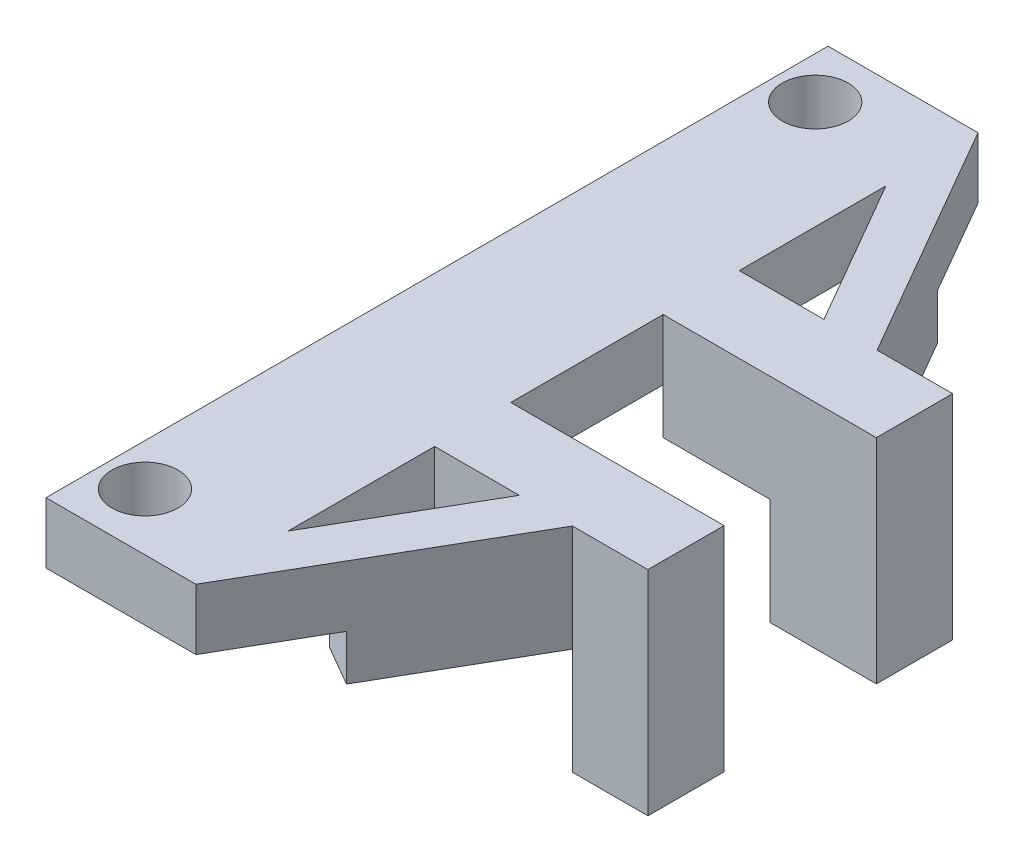
ISO-10303-21;
HEADER;
FILE_DESCRIPTION(('STEP AP214'),'2;1');
FILE_NAME('part.step','',(''),(''),'','','');
FILE_SCHEMA(('AUTOMOTIVE_DESIGN { 1 0 10303 214 1 1 1 1 }'));
ENDSEC;
DATA;
#1=APPLICATION_CONTEXT('core data for automotive mechanical design processes');
#2=APPLICATION_PROTOCOL_DEFINITION('international standard','automotive_design',2000,#1);
#3=PRODUCT_CONTEXT('',#1,'mechanical');
#4=PRODUCT('Part','Part','',(#3));
#5=PRODUCT_RELATED_PRODUCT_CATEGORY('part','',(#4));
#6=PRODUCT_DEFINITION_FORMATION('','',#4);
#7=PRODUCT_DEFINITION_CONTEXT('part definition',#1,'design');
#8=PRODUCT_DEFINITION('design','',#6,#7);
#9=PRODUCT_DEFINITION_SHAPE('','',#8);
#10=(LENGTH_UNIT() NAMED_UNIT(*) SI_UNIT(.MILLI.,.METRE.));
#11=(NAMED_UNIT(*) PLANE_ANGLE_UNIT() SI_UNIT($,.RADIAN.));
#12=(NAMED_UNIT(*) SI_UNIT($,.STERADIAN.) SOLID_ANGLE_UNIT());
#13=UNCERTAINTY_MEASURE_WITH_UNIT(LENGTH_MEASURE(1.E-05),#10,'distance_accuracy_value','');
#14=(GEOMETRIC_REPRESENTATION_CONTEXT(3) GLOBAL_UNCERTAINTY_ASSIGNED_CONTEXT((#13)) GLOBAL_UNIT_ASSIGNED_CONTEXT((#10,
#11,#12)) REPRESENTATION_CONTEXT('',''));
#15=CARTESIAN_POINT('',(0.,0.,0.));
#16=DIRECTION('',(0.,0.,1.));
#17=DIRECTION('',(1.,0.,0.));
#18=AXIS2_PLACEMENT_3D('',#15,#16,#17);
#19=CARTESIAN_POINT('',(0.,-1.905,0.));
#20=DIRECTION('',(0.,1.,0.));
#21=DIRECTION('',(0.,0.,1.));
#22=AXIS2_PLACEMENT_3D('',#19,#20,#21);
#23=PLANE('',#22);
#24=DIRECTION('',(0.499999999999997,0.,-0.86602540378444));
#25=VECTOR('',#24,1.);
#26=CARTESIAN_POINT('',(4.40340516699403,-1.905,2.54230715851497));
#27=LINE('',#26,#25);
#28=CARTESIAN_POINT('',(10.2449238535713,-1.905,-7.5755));
#29=VERTEX_POINT('',#28);
#30=CARTESIAN_POINT('',(10.6073505544324,-1.905,-8.20324145991094));
#31=VERTEX_POINT('',#30);
#32=EDGE_CURVE('E701',#29,#31,#27,.T.);
#33=ORIENTED_EDGE('',*,*,#32,.F.);
#34=DIRECTION('',(0.499999999999997,0.,-0.86602540378444));
#35=VECTOR('',#34,1.);
#36=CARTESIAN_POINT('',(4.40340516699403,-1.905,2.54230715851497));
#37=LINE('',#36,#35);
#38=CARTESIAN_POINT('',(6.79735055443242,-1.905,-1.60412788307351));
#39=VERTEX_POINT('',#38);
#40=EDGE_CURVE('E530',#39,#29,#37,.T.);
#41=ORIENTED_EDGE('',*,*,#40,.F.);
#42=DIRECTION('',(0.86602540378444,0.,0.499999999999997));
#43=VECTOR('',#42,1.);
#44=CARTESIAN_POINT('',(2.39394538743839,-1.905,-4.14643504158848));
#45=LINE('',#44,#43);
#46=CARTESIAN_POINT('',(5.13500000000002,-1.905,-2.56388642316257));
#47=VERTEX_POINT('',#46);
#48=EDGE_CURVE('E527',#47,#39,#45,.T.);
#49=ORIENTED_EDGE('',*,*,#48,.F.);
#50=DIRECTION('',(0.499999999999997,0.,-0.86602540378444));
#51=VECTOR('',#50,1.);
#52=CARTESIAN_POINT('',(2.74105461256163,-1.905,1.58254861842591));
#53=LINE('',#52,#51);
#54=CARTESIAN_POINT('',(8.02845644766147,-1.905,-7.5755));
#55=VERTEX_POINT('',#54);
#56=EDGE_CURVE('E524',#47,#55,#53,.T.);
#57=ORIENTED_EDGE('',*,*,#56,.T.);
#58=DIRECTION('',(1.,0.,0.));
#59=VECTOR('',#58,1.);
#60=CARTESIAN_POINT('',(0.,-1.905,-7.5755));
#61=LINE('',#60,#59);
#62=CARTESIAN_POINT('',(4.5,-1.905,-7.5755));
#63=VERTEX_POINT('',#62);
#64=EDGE_CURVE('E521',#63,#55,#61,.T.);
#65=ORIENTED_EDGE('',*,*,#64,.F.);
#66=DIRECTION('',(0.,0.,-1.));
#67=VECTOR('',#66,1.);
#68=CARTESIAN_POINT('',(4.5,-1.905,0.));
#69=LINE('',#68,#67);
#70=CARTESIAN_POINT('',(4.5,-1.905,-10.7505));
#71=VERTEX_POINT('',#70);
#72=EDGE_CURVE('E518',#63,#71,#69,.T.);
#73=ORIENTED_EDGE('',*,*,#72,.T.);
#74=DIRECTION('',(1.,0.,0.));
#75=VECTOR('',#74,1.);
#76=CARTESIAN_POINT('',(0.,-1.905,-10.7505));
#77=LINE('',#76,#75);
#78=CARTESIAN_POINT('',(8.945,-1.905,-10.7505));
#79=VERTEX_POINT('',#78);
#80=EDGE_CURVE('E516',#71,#79,#77,.T.);
#81=ORIENTED_EDGE('',*,*,#80,.T.);
#82=DIRECTION('',(0.,0.,1.));
#83=VECTOR('',#82,1.);
#84=CARTESIAN_POINT('',(8.945,-1.905,0.));
#85=LINE('',#84,#83);
#86=CARTESIAN_POINT('',(8.945,-1.905,-9.163));
#87=VERTEX_POINT('',#86);
#88=EDGE_CURVE('E453',#79,#87,#85,.T.);
#89=ORIENTED_EDGE('',*,*,#88,.T.);
#90=DIRECTION('',(-0.866025403784441,0.,-0.499999999999997));
#91=VECTOR('',#90,1.);
#92=CARTESIAN_POINT('',(6.20394538743836,-1.905,-10.7455486184259));
#93=LINE('',#92,#91);
#94=EDGE_CURVE('E699',#31,#87,#93,.T.);
#95=ORIENTED_EDGE('',*,*,#94,.F.);
#96=EDGE_LOOP('',(#33,#41,#49,#57,#65,#73,#81,#89,#95));
#97=FACE_BOUND('',#96,.T.);
#98=ADVANCED_FACE('F245',(#97),#23,.F.);
#99=CARTESIAN_POINT('',(0.,0.,0.));
#100=DIRECTION('',(0.,1.,0.));
#101=DIRECTION('',(0.,0.,1.));
#102=AXIS2_PLACEMENT_3D('',#99,#100,#101);
#103=PLANE('',#102);
#104=CARTESIAN_POINT('',(0.,0.,0.));
#105=DIRECTION('',(0.,1.,0.));
#106=DIRECTION('',(0.,0.,1.));
#107=AXIS2_PLACEMENT_3D('',#104,#105,#106);
#108=CIRCLE('',#107,1.375);
#109=CARTESIAN_POINT('',(0.,0.,1.375));
#110=VERTEX_POINT('',#109);
#111=EDGE_CURVE('E649',#110,#110,#108,.T.);
#112=ORIENTED_EDGE('',*,*,#111,.T.);
#113=EDGE_LOOP('',(#112));
#114=FACE_BOUND('',#113,.T.);
#115=CARTESIAN_POINT('',(0.,0.,-27.94));
#116=DIRECTION('',(0.,1.,0.));
#117=DIRECTION('',(0.,0.,1.));
#118=AXIS2_PLACEMENT_3D('',#115,#116,#117);
#119=CIRCLE('',#118,1.375);
#120=CARTESIAN_POINT('',(0.,0.,-26.565));
#121=VERTEX_POINT('',#120);
#122=EDGE_CURVE('E584',#121,#121,#119,.T.);
#123=ORIENTED_EDGE('',*,*,#122,.T.);
#124=EDGE_LOOP('',(#123));
#125=FACE_BOUND('',#124,.T.);
#126=DIRECTION('',(0.,0.,-1.));
#127=VECTOR('',#126,1.);
#128=CARTESIAN_POINT('',(4.5,0.,0.));
#129=LINE('',#128,#127);
#130=CARTESIAN_POINT('',(4.5,0.,-7.5755));
#131=VERTEX_POINT('',#130);
#132=CARTESIAN_POINT('',(4.5,0.,-10.7505));
#133=VERTEX_POINT('',#132);
#134=EDGE_CURVE('E534',#131,#133,#129,.T.);
#135=ORIENTED_EDGE('',*,*,#134,.F.);
#136=DIRECTION('',(0.,0.,-1.));
#137=VECTOR('',#136,1.);
#138=CARTESIAN_POINT('',(4.5,0.,0.));
#139=LINE('',#138,#137);
#140=CARTESIAN_POINT('',(4.5,0.,-1.46403416035628));
#141=VERTEX_POINT('',#140);
#142=EDGE_CURVE('E640',#141,#131,#139,.T.);
#143=ORIENTED_EDGE('',*,*,#142,.F.);
#144=DIRECTION('',(0.499999999999997,0.,-0.86602540378444));
#145=VECTOR('',#144,1.);
#146=CARTESIAN_POINT('',(2.74105461256163,0.,1.58254861842591));
#147=LINE('',#146,#145);
#148=CARTESIAN_POINT('',(5.13500000000002,0.,-2.56388642316257));
#149=VERTEX_POINT('',#148);
#150=EDGE_CURVE('E652',#141,#149,#147,.T.);
#151=ORIENTED_EDGE('',*,*,#150,.T.);
#152=DIRECTION('',(0.86602540378444,0.,0.499999999999997));
#153=VECTOR('',#152,1.);
#154=CARTESIAN_POINT('',(2.39394538743839,0.,-4.14643504158848));
#155=LINE('',#154,#153);
#156=CARTESIAN_POINT('',(6.79735055443242,0.,-1.60412788307351));
#157=VERTEX_POINT('',#156);
#158=EDGE_CURVE('E519',#149,#157,#155,.T.);
#159=ORIENTED_EDGE('',*,*,#158,.T.);
#160=DIRECTION('',(0.499999999999997,0.,-0.86602540378444));
#161=VECTOR('',#160,1.);
#162=CARTESIAN_POINT('',(4.40340516699403,0.,2.54230715851497));
#163=LINE('',#162,#161);
#164=CARTESIAN_POINT('',(4.5,0.,2.375));
#165=VERTEX_POINT('',#164);
#166=EDGE_CURVE('E633',#165,#157,#163,.T.);
#167=ORIENTED_EDGE('',*,*,#166,.F.);
#168=DIRECTION('',(1.,0.,0.));
#169=VECTOR('',#168,1.);
#170=CARTESIAN_POINT('',(0.,0.,2.375));
#171=LINE('',#170,#169);
#172=CARTESIAN_POINT('',(-1.75,0.,2.375));
#173=VERTEX_POINT('',#172);
#174=EDGE_CURVE('E629',#173,#165,#171,.T.);
#175=ORIENTED_EDGE('',*,*,#174,.F.);
#176=DIRECTION('',(0.,0.,-1.));
#177=VECTOR('',#176,1.);
#178=CARTESIAN_POINT('',(-1.75,0.,0.));
#179=LINE('',#178,#177);
#180=CARTESIAN_POINT('',(-1.75,0.,-30.226));
#181=VERTEX_POINT('',#180);
#182=EDGE_CURVE('E626',#173,#181,#179,.T.);
#183=ORIENTED_EDGE('',*,*,#182,.T.);
#184=DIRECTION('',(1.,0.,0.));
#185=VECTOR('',#184,1.);
#186=CARTESIAN_POINT('',(0.,0.,-30.226));
#187=LINE('',#186,#185);
#188=CARTESIAN_POINT('',(4.5,0.,-30.226));
#189=VERTEX_POINT('',#188);
#190=EDGE_CURVE('E646',#181,#189,#187,.T.);
#191=ORIENTED_EDGE('',*,*,#190,.T.);
#192=DIRECTION('',(0.499999999999998,0.,0.86602540378444));
#193=VECTOR('',#192,1.);
#194=CARTESIAN_POINT('',(16.4632419273942,0.,-9.50505715851491));
#195=LINE('',#194,#193);
#196=CARTESIAN_POINT('',(6.79735055443242,0.,-26.2468721169265));
#197=VERTEX_POINT('',#196);
#198=EDGE_CURVE('E644',#189,#197,#195,.T.);
#199=ORIENTED_EDGE('',*,*,#198,.T.);
#200=DIRECTION('',(0.86602540378444,0.,-0.499999999999998));
#201=VECTOR('',#200,1.);
#202=CARTESIAN_POINT('',(-9.66589137296177,0.,-16.7418149584116));
#203=LINE('',#202,#201);
#204=CARTESIAN_POINT('',(5.13500000000003,0.,-25.2871135768374));
#205=VERTEX_POINT('',#204);
#206=EDGE_CURVE('E485',#205,#197,#203,.T.);
#207=ORIENTED_EDGE('',*,*,#206,.F.);
#208=DIRECTION('',(0.499999999999998,0.,0.86602540378444));
#209=VECTOR('',#208,1.);
#210=CARTESIAN_POINT('',(14.8008913729618,0.,-8.54529861842585));
#211=LINE('',#210,#209);
#212=CARTESIAN_POINT('',(4.5,0.,-26.3869658396437));
#213=VERTEX_POINT('',#212);
#214=EDGE_CURVE('E641',#213,#205,#211,.T.);
#215=ORIENTED_EDGE('',*,*,#214,.F.);
#216=CARTESIAN_POINT('',(4.5,0.,-20.2755));
#217=VERTEX_POINT('',#216);
#218=EDGE_CURVE('E639',#217,#213,#139,.T.);
#219=ORIENTED_EDGE('',*,*,#218,.F.);
#220=DIRECTION('',(0.,0.,-1.));
#221=VECTOR('',#220,1.);
#222=CARTESIAN_POINT('',(4.5,0.,0.));
#223=LINE('',#222,#221);
#224=CARTESIAN_POINT('',(4.5,0.,-17.1005));
#225=VERTEX_POINT('',#224);
#226=EDGE_CURVE('E552',#225,#217,#223,.T.);
#227=ORIENTED_EDGE('',*,*,#226,.F.);
#228=EDGE_CURVE('E636',#133,#225,#139,.T.);
#229=ORIENTED_EDGE('',*,*,#228,.F.);
#230=EDGE_LOOP('',(#135,#143,#151,#159,#167,#175,#183,#191,#199,#207,#215,#219,#227,#229));
#231=FACE_BOUND('',#230,.T.);
#232=ADVANCED_FACE('F732',(#114,#125,#231),#103,.F.);
#233=CARTESIAN_POINT('',(16.4632419273942,2.54,-9.50505715851491));
#234=DIRECTION('',(0.86602540378444,0.,-0.499999999999998));
#235=DIRECTION('',(-0.499999999999998,0.,-0.86602540378444));
#236=AXIS2_PLACEMENT_3D('',#233,#234,#235);
#237=PLANE('',#236);
#238=ORIENTED_EDGE('',*,*,#198,.F.);
#239=DIRECTION('',(0.,-1.,0.));
#240=VECTOR('',#239,1.);
#241=CARTESIAN_POINT('',(4.5,2.54,-30.226));
#242=LINE('',#241,#240);
#243=CARTESIAN_POINT('',(4.5,2.54,-30.226));
#244=VERTEX_POINT('',#243);
#245=EDGE_CURVE('E666',#244,#189,#242,.T.);
#246=ORIENTED_EDGE('',*,*,#245,.F.);
#247=DIRECTION('',(0.499999999999998,0.,0.86602540378444));
#248=VECTOR('',#247,1.);
#249=CARTESIAN_POINT('',(16.4632419273942,2.54,-9.50505715851491));
#250=LINE('',#249,#248);
#251=CARTESIAN_POINT('',(10.2449238535713,2.54,-20.2755));
#252=VERTEX_POINT('',#251);
#253=EDGE_CURVE('E608',#244,#252,#250,.T.);
#254=ORIENTED_EDGE('',*,*,#253,.T.);
#255=DIRECTION('',(0.,-1.,0.));
#256=VECTOR('',#255,1.);
#257=CARTESIAN_POINT('',(10.2449238535713,2.54,-20.2755));
#258=LINE('',#257,#256);
#259=CARTESIAN_POINT('',(10.2449238535713,-1.905,-20.2755));
#260=VERTEX_POINT('',#259);
#261=EDGE_CURVE('E630',#252,#260,#258,.T.);
#262=ORIENTED_EDGE('',*,*,#261,.T.);
#263=DIRECTION('',(0.499999999999998,0.,0.86602540378444));
#264=VECTOR('',#263,1.);
#265=CARTESIAN_POINT('',(16.4632419273942,-1.905,-9.50505715851491));
#266=LINE('',#265,#264);
#267=CARTESIAN_POINT('',(6.79735055443242,-1.905,-26.2468721169265));
#268=VERTEX_POINT('',#267);
#269=EDGE_CURVE('E548',#268,#260,#266,.T.);
#270=ORIENTED_EDGE('',*,*,#269,.F.);
#271=DIRECTION('',(0.,1.,0.));
#272=VECTOR('',#271,1.);
#273=CARTESIAN_POINT('',(6.79735055443242,-1.905,-26.2468721169265));
#274=LINE('',#273,#272);
#275=EDGE_CURVE('E565',#268,#197,#274,.T.);
#276=ORIENTED_EDGE('',*,*,#275,.T.);
#277=EDGE_LOOP('',(#238,#246,#254,#262,#270,#276));
#278=FACE_BOUND('',#277,.T.);
#279=ADVANCED_FACE('F740',(#278),#237,.T.);
#280=CARTESIAN_POINT('',(14.8008913729618,2.54,-8.54529861842585));
#281=DIRECTION('',(0.86602540378444,0.,-0.499999999999998));
#282=DIRECTION('',(-0.499999999999998,0.,-0.86602540378444));
#283=AXIS2_PLACEMENT_3D('',#280,#281,#282);
#284=PLANE('',#283);
#285=ORIENTED_EDGE('',*,*,#214,.T.);
#286=DIRECTION('',(0.,1.,0.));
#287=VECTOR('',#286,1.);
#288=CARTESIAN_POINT('',(5.13500000000003,-1.905,-25.2871135768374));
#289=LINE('',#288,#287);
#290=CARTESIAN_POINT('',(5.13500000000003,-1.905,-25.2871135768374));
#291=VERTEX_POINT('',#290);
#292=EDGE_CURVE('E575',#291,#205,#289,.T.);
#293=ORIENTED_EDGE('',*,*,#292,.F.);
#294=DIRECTION('',(0.499999999999998,0.,0.86602540378444));
#295=VECTOR('',#294,1.);
#296=CARTESIAN_POINT('',(14.8008913729618,-1.905,-8.54529861842585));
#297=LINE('',#296,#295);
#298=CARTESIAN_POINT('',(8.02845644766148,-1.905,-20.2755));
#299=VERTEX_POINT('',#298);
#300=EDGE_CURVE('E554',#291,#299,#297,.T.);
#301=ORIENTED_EDGE('',*,*,#300,.T.);
#302=DIRECTION('',(0.,-1.,0.));
#303=VECTOR('',#302,1.);
#304=CARTESIAN_POINT('',(8.02845644766148,2.54,-20.2755));
#305=LINE('',#304,#303);
#306=CARTESIAN_POINT('',(8.02845644766148,2.54,-20.2755));
#307=VERTEX_POINT('',#306);
#308=EDGE_CURVE('E673',#307,#299,#305,.T.);
#309=ORIENTED_EDGE('',*,*,#308,.F.);
#310=DIRECTION('',(0.499999999999998,0.,0.86602540378444));
#311=VECTOR('',#310,1.);
#312=CARTESIAN_POINT('',(14.8008913729618,2.54,-8.54529861842585));
#313=LINE('',#312,#311);
#314=CARTESIAN_POINT('',(4.5,2.54,-26.3869658396437));
#315=VERTEX_POINT('',#314);
#316=EDGE_CURVE('E606',#315,#307,#313,.T.);
#317=ORIENTED_EDGE('',*,*,#316,.F.);
#318=DIRECTION('',(0.,-1.,0.));
#319=VECTOR('',#318,1.);
#320=CARTESIAN_POINT('',(4.5,2.54,-26.3869658396437));
#321=LINE('',#320,#319);
#322=EDGE_CURVE('E668',#315,#213,#321,.T.);
#323=ORIENTED_EDGE('',*,*,#322,.T.);
#324=EDGE_LOOP('',(#285,#293,#301,#309,#317,#323));
#325=FACE_BOUND('',#324,.T.);
#326=ADVANCED_FACE('F791',(#325),#284,.F.);
#327=CARTESIAN_POINT('',(2.74105461256163,2.54,1.58254861842591));
#328=DIRECTION('',(-0.86602540378444,0.,-0.499999999999997));
#329=DIRECTION('',(-0.499999999999997,0.,0.866025403784441));
#330=AXIS2_PLACEMENT_3D('',#327,#328,#329);
#331=PLANE('',#330);
#332=ORIENTED_EDGE('',*,*,#150,.F.);
#333=DIRECTION('',(0.,-1.,0.));
#334=VECTOR('',#333,1.);
#335=CARTESIAN_POINT('',(4.5,2.54,-1.46403416035628));
#336=LINE('',#335,#334);
#337=CARTESIAN_POINT('',(4.5,2.54,-1.46403416035628));
#338=VERTEX_POINT('',#337);
#339=EDGE_CURVE('E663',#338,#141,#336,.T.);
#340=ORIENTED_EDGE('',*,*,#339,.F.);
#341=DIRECTION('',(0.499999999999997,0.,-0.86602540378444));
#342=VECTOR('',#341,1.);
#343=CARTESIAN_POINT('',(2.74105461256163,2.54,1.58254861842591));
#344=LINE('',#343,#342);
#345=CARTESIAN_POINT('',(8.02845644766147,2.54,-7.5755));
#346=VERTEX_POINT('',#345);
#347=EDGE_CURVE('E616',#338,#346,#344,.T.);
#348=ORIENTED_EDGE('',*,*,#347,.T.);
#349=DIRECTION('',(0.,-1.,0.));
#350=VECTOR('',#349,1.);
#351=CARTESIAN_POINT('',(8.02845644766147,2.54,-7.5755));
#352=LINE('',#351,#350);
#353=EDGE_CURVE('E657',#346,#55,#352,.T.);
#354=ORIENTED_EDGE('',*,*,#353,.T.);
#355=ORIENTED_EDGE('',*,*,#56,.F.);
#356=DIRECTION('',(0.,1.,0.));
#357=VECTOR('',#356,1.);
#358=CARTESIAN_POINT('',(5.13500000000002,-1.905,-2.56388642316257));
#359=LINE('',#358,#357);
#360=EDGE_CURVE('E542',#47,#149,#359,.T.);
#361=ORIENTED_EDGE('',*,*,#360,.T.);
#362=EDGE_LOOP('',(#332,#340,#348,#354,#355,#361));
#363=FACE_BOUND('',#362,.T.);
#364=ADVANCED_FACE('F788',(#363),#331,.T.);
#365=CARTESIAN_POINT('',(4.40340516699403,2.54,2.54230715851497));
#366=DIRECTION('',(-0.86602540378444,0.,-0.499999999999997));
#367=DIRECTION('',(-0.499999999999997,0.,0.86602540378444));
#368=AXIS2_PLACEMENT_3D('',#365,#366,#367);
#369=PLANE('',#368);
#370=ORIENTED_EDGE('',*,*,#166,.T.);
#371=DIRECTION('',(0.,1.,0.));
#372=VECTOR('',#371,1.);
#373=CARTESIAN_POINT('',(6.79735055443242,-1.905,-1.60412788307351));
#374=LINE('',#373,#372);
#375=EDGE_CURVE('E539',#39,#157,#374,.T.);
#376=ORIENTED_EDGE('',*,*,#375,.F.);
#377=ORIENTED_EDGE('',*,*,#40,.T.);
#378=DIRECTION('',(0.,-1.,0.));
#379=VECTOR('',#378,1.);
#380=CARTESIAN_POINT('',(10.2449238535713,2.54,-7.5755));
#381=LINE('',#380,#379);
#382=CARTESIAN_POINT('',(10.2449238535713,2.54,-7.5755));
#383=VERTEX_POINT('',#382);
#384=EDGE_CURVE('E684',#383,#29,#381,.T.);
#385=ORIENTED_EDGE('',*,*,#384,.F.);
#386=DIRECTION('',(0.499999999999997,0.,-0.86602540378444));
#387=VECTOR('',#386,1.);
#388=CARTESIAN_POINT('',(4.40340516699403,2.54,2.54230715851497));
#389=LINE('',#388,#387);
#390=CARTESIAN_POINT('',(4.5,2.54,2.375));
#391=VERTEX_POINT('',#390);
#392=EDGE_CURVE('E587',#391,#383,#389,.T.);
#393=ORIENTED_EDGE('',*,*,#392,.F.);
#394=DIRECTION('',(0.,-1.,0.));
#395=VECTOR('',#394,1.);
#396=CARTESIAN_POINT('',(4.5,2.54,2.375));
#397=LINE('',#396,#395);
#398=EDGE_CURVE('E686',#391,#165,#397,.T.);
#399=ORIENTED_EDGE('',*,*,#398,.T.);
#400=EDGE_LOOP('',(#370,#376,#377,#385,#393,#399));
#401=FACE_BOUND('',#400,.T.);
#402=ADVANCED_FACE('F768',(#401),#369,.F.);
#403=CARTESIAN_POINT('',(0.,2.54,0.));
#404=DIRECTION('',(0.,1.,0.));
#405=DIRECTION('',(0.,0.,1.));
#406=AXIS2_PLACEMENT_3D('',#403,#404,#405);
#407=PLANE('',#406);
#408=DIRECTION('',(1.,0.,0.));
#409=VECTOR('',#408,1.);
#410=CARTESIAN_POINT('',(4.50000000000001,2.54,-20.2755));
#411=LINE('',#410,#409);
#412=CARTESIAN_POINT('',(13.39,2.54,-20.2755));
#413=VERTEX_POINT('',#412);
#414=EDGE_CURVE('E691',#252,#413,#411,.T.);
#415=ORIENTED_EDGE('',*,*,#414,.F.);
#416=ORIENTED_EDGE('',*,*,#253,.F.);
#417=DIRECTION('',(1.,0.,0.));
#418=VECTOR('',#417,1.);
#419=CARTESIAN_POINT('',(0.,2.54,-30.226));
#420=LINE('',#419,#418);
#421=CARTESIAN_POINT('',(-1.75,2.54,-30.226));
#422=VERTEX_POINT('',#421);
#423=EDGE_CURVE('E610',#422,#244,#420,.T.);
#424=ORIENTED_EDGE('',*,*,#423,.F.);
#425=DIRECTION('',(0.,0.,-1.));
#426=VECTOR('',#425,1.);
#427=CARTESIAN_POINT('',(-1.75,2.54,0.));
#428=LINE('',#427,#426);
#429=CARTESIAN_POINT('',(-1.75,2.54,2.375));
#430=VERTEX_POINT('',#429);
#431=EDGE_CURVE('E580',#430,#422,#428,.T.);
#432=ORIENTED_EDGE('',*,*,#431,.F.);
#433=DIRECTION('',(1.,0.,0.));
#434=VECTOR('',#433,1.);
#435=CARTESIAN_POINT('',(0.,2.54,2.375));
#436=LINE('',#435,#434);
#437=EDGE_CURVE('E583',#430,#391,#436,.T.);
#438=ORIENTED_EDGE('',*,*,#437,.T.);
#439=ORIENTED_EDGE('',*,*,#392,.T.);
#440=DIRECTION('',(1.,0.,0.));
#441=VECTOR('',#440,1.);
#442=CARTESIAN_POINT('',(0.,2.54,-7.5755));
#443=LINE('',#442,#441);
#444=CARTESIAN_POINT('',(13.39,2.54,-7.5755));
#445=VERTEX_POINT('',#444);
#446=EDGE_CURVE('E590',#383,#445,#443,.T.);
#447=ORIENTED_EDGE('',*,*,#446,.T.);
#448=DIRECTION('',(0.,0.,-1.));
#449=VECTOR('',#448,1.);
#450=CARTESIAN_POINT('',(13.39,2.54,0.));
#451=LINE('',#450,#449);
#452=CARTESIAN_POINT('',(13.39,2.54,-10.7505));
#453=VERTEX_POINT('',#452);
#454=EDGE_CURVE('E592',#445,#453,#451,.T.);
#455=ORIENTED_EDGE('',*,*,#454,.T.);
#456=DIRECTION('',(1.,0.,0.));
#457=VECTOR('',#456,1.);
#458=CARTESIAN_POINT('',(0.,2.54,-10.7505));
#459=LINE('',#458,#457);
#460=CARTESIAN_POINT('',(4.5,2.54,-10.7505));
#461=VERTEX_POINT('',#460);
#462=EDGE_CURVE('E594',#461,#453,#459,.T.);
#463=ORIENTED_EDGE('',*,*,#462,.F.);
#464=DIRECTION('',(0.,0.,-1.));
#465=VECTOR('',#464,1.);
#466=CARTESIAN_POINT('',(4.5,2.54,0.));
#467=LINE('',#466,#465);
#468=CARTESIAN_POINT('',(4.5,2.54,-17.1005));
#469=VERTEX_POINT('',#468);
#470=EDGE_CURVE('E596',#461,#469,#467,.T.);
#471=ORIENTED_EDGE('',*,*,#470,.T.);
#472=DIRECTION('',(1.,0.,0.));
#473=VECTOR('',#472,1.);
#474=CARTESIAN_POINT('',(0.,2.54,-17.1005));
#475=LINE('',#474,#473);
#476=CARTESIAN_POINT('',(13.39,2.54,-17.1005));
#477=VERTEX_POINT('',#476);
#478=EDGE_CURVE('E599',#469,#477,#475,.T.);
#479=ORIENTED_EDGE('',*,*,#478,.T.);
#480=DIRECTION('',(0.,0.,-1.));
#481=VECTOR('',#480,1.);
#482=CARTESIAN_POINT('',(13.39,2.54,-17.1005));
#483=LINE('',#482,#481);
#484=EDGE_CURVE('E541',#477,#413,#483,.T.);
#485=ORIENTED_EDGE('',*,*,#484,.T.);
#486=EDGE_LOOP('',(#415,#416,#424,#432,#438,#439,#447,#455,#463,#471,#479,#485));
#487=FACE_BOUND('',#486,.T.);
#488=ORIENTED_EDGE('',*,*,#316,.T.);
#489=DIRECTION('',(1.,0.,0.));
#490=VECTOR('',#489,1.);
#491=CARTESIAN_POINT('',(0.,2.54,-20.2755));
#492=LINE('',#491,#490);
#493=CARTESIAN_POINT('',(4.5,2.54,-20.2755));
#494=VERTEX_POINT('',#493);
#495=EDGE_CURVE('E603',#494,#307,#492,.T.);
#496=ORIENTED_EDGE('',*,*,#495,.F.);
#497=EDGE_CURVE('E601',#494,#315,#467,.T.);
#498=ORIENTED_EDGE('',*,*,#497,.T.);
#499=EDGE_LOOP('',(#488,#496,#498));
#500=FACE_BOUND('',#499,.T.);
#501=DIRECTION('',(1.,0.,0.));
#502=VECTOR('',#501,1.);
#503=CARTESIAN_POINT('',(0.,2.54,-7.5755));
#504=LINE('',#503,#502);
#505=CARTESIAN_POINT('',(4.5,2.54,-7.5755));
#506=VERTEX_POINT('',#505);
#507=EDGE_CURVE('E619',#506,#346,#504,.T.);
#508=ORIENTED_EDGE('',*,*,#507,.T.);
#509=ORIENTED_EDGE('',*,*,#347,.F.);
#510=EDGE_CURVE('E600',#338,#506,#467,.T.);
#511=ORIENTED_EDGE('',*,*,#510,.T.);
#512=EDGE_LOOP('',(#508,#509,#511));
#513=FACE_BOUND('',#512,.T.);
#514=CARTESIAN_POINT('',(0.,2.54,0.));
#515=DIRECTION('',(0.,1.,0.));
#516=DIRECTION('',(0.,0.,1.));
#517=AXIS2_PLACEMENT_3D('',#514,#515,#516);
#518=CIRCLE('',#517,1.375);
#519=CARTESIAN_POINT('',(0.,2.54,1.375));
#520=VERTEX_POINT('',#519);
#521=EDGE_CURVE('E613',#520,#520,#518,.T.);
#522=ORIENTED_EDGE('',*,*,#521,.F.);
#523=EDGE_LOOP('',(#522));
#524=FACE_BOUND('',#523,.T.);
#525=CARTESIAN_POINT('',(0.,2.54,-27.94));
#526=DIRECTION('',(0.,1.,0.));
#527=DIRECTION('',(0.,0.,1.));
#528=AXIS2_PLACEMENT_3D('',#525,#526,#527);
#529=CIRCLE('',#528,1.375);
#530=CARTESIAN_POINT('',(0.,2.54,-26.565));
#531=VERTEX_POINT('',#530);
#532=EDGE_CURVE('E622',#531,#531,#529,.T.);
#533=ORIENTED_EDGE('',*,*,#532,.F.);
#534=EDGE_LOOP('',(#533));
#535=FACE_BOUND('',#534,.T.);
#536=ADVANCED_FACE('F762',(#487,#500,#513,#524,#535),#407,.T.);
#537=CARTESIAN_POINT('',(0.,2.54,-17.1005));
#538=DIRECTION('',(0.,0.,-1.));
#539=DIRECTION('',(-1.,0.,0.));
#540=AXIS2_PLACEMENT_3D('',#537,#538,#539);
#541=PLANE('',#540);
#542=DIRECTION('',(1.,0.,0.));
#543=VECTOR('',#542,1.);
#544=CARTESIAN_POINT('',(0.,-1.905,-17.1005));
#545=LINE('',#544,#543);
#546=CARTESIAN_POINT('',(4.5,-1.905,-17.1005));
#547=VERTEX_POINT('',#546);
#548=CARTESIAN_POINT('',(8.94500000000001,-1.905,-17.1005));
#549=VERTEX_POINT('',#548);
#550=EDGE_CURVE('E562',#547,#549,#545,.T.);
#551=ORIENTED_EDGE('',*,*,#550,.T.);
#552=DIRECTION('',(0.,1.,0.));
#553=VECTOR('',#552,1.);
#554=CARTESIAN_POINT('',(8.94500000000001,-6.35,-17.1005));
#555=LINE('',#554,#553);
#556=CARTESIAN_POINT('',(8.94500000000001,-6.35,-17.1005));
#557=VERTEX_POINT('',#556);
#558=EDGE_CURVE('E260',#557,#549,#555,.T.);
#559=ORIENTED_EDGE('',*,*,#558,.F.);
#560=DIRECTION('',(1.,0.,0.));
#561=VECTOR('',#560,1.);
#562=CARTESIAN_POINT('',(0.,-6.35,-17.1005));
#563=LINE('',#562,#561);
#564=CARTESIAN_POINT('',(13.39,-6.35,-17.1005));
#565=VERTEX_POINT('',#564);
#566=EDGE_CURVE('E495',#557,#565,#563,.T.);
#567=ORIENTED_EDGE('',*,*,#566,.T.);
#568=DIRECTION('',(0.,-1.,0.));
#569=VECTOR('',#568,1.);
#570=CARTESIAN_POINT('',(13.39,2.54,-17.1005));
#571=LINE('',#570,#569);
#572=EDGE_CURVE('E695',#477,#565,#571,.T.);
#573=ORIENTED_EDGE('',*,*,#572,.F.);
#574=ORIENTED_EDGE('',*,*,#478,.F.);
#575=DIRECTION('',(0.,-1.,0.));
#576=VECTOR('',#575,1.);
#577=CARTESIAN_POINT('',(4.5,2.54,-17.1005));
#578=LINE('',#577,#576);
#579=EDGE_CURVE('E675',#469,#225,#578,.T.);
#580=ORIENTED_EDGE('',*,*,#579,.T.);
#581=DIRECTION('',(0.,1.,0.));
#582=VECTOR('',#581,1.);
#583=CARTESIAN_POINT('',(4.5,-1.905,-17.1005));
#584=LINE('',#583,#582);
#585=EDGE_CURVE('E536',#547,#225,#584,.T.);
#586=ORIENTED_EDGE('',*,*,#585,.F.);
#587=EDGE_LOOP('',(#551,#559,#567,#573,#574,#580,#586));
#588=FACE_BOUND('',#587,.T.);
#589=ADVANCED_FACE('F767',(#588),#541,.F.);
#590=CARTESIAN_POINT('',(0.,2.54,-20.2755));
#591=DIRECTION('',(0.,0.,-1.));
#592=DIRECTION('',(-1.,0.,0.));
#593=AXIS2_PLACEMENT_3D('',#590,#591,#592);
#594=PLANE('',#593);
#595=ORIENTED_EDGE('',*,*,#308,.T.);
#596=DIRECTION('',(1.,0.,0.));
#597=VECTOR('',#596,1.);
#598=CARTESIAN_POINT('',(0.,-1.905,-20.2755));
#599=LINE('',#598,#597);
#600=CARTESIAN_POINT('',(4.5,-1.905,-20.2755));
#601=VERTEX_POINT('',#600);
#602=EDGE_CURVE('E557',#601,#299,#599,.T.);
#603=ORIENTED_EDGE('',*,*,#602,.F.);
#604=DIRECTION('',(0.,1.,0.));
#605=VECTOR('',#604,1.);
#606=CARTESIAN_POINT('',(4.5,-1.905,-20.2755));
#607=LINE('',#606,#605);
#608=EDGE_CURVE('E572',#601,#217,#607,.T.);
#609=ORIENTED_EDGE('',*,*,#608,.T.);
#610=DIRECTION('',(0.,-1.,0.));
#611=VECTOR('',#610,1.);
#612=CARTESIAN_POINT('',(4.5,2.54,-20.2755));
#613=LINE('',#612,#611);
#614=EDGE_CURVE('E670',#494,#217,#613,.T.);
#615=ORIENTED_EDGE('',*,*,#614,.F.);
#616=ORIENTED_EDGE('',*,*,#495,.T.);
#617=EDGE_LOOP('',(#595,#603,#609,#615,#616));
#618=FACE_BOUND('',#617,.T.);
#619=ADVANCED_FACE('F770',(#618),#594,.T.);
#620=CARTESIAN_POINT('',(4.5,2.54,0.));
#621=DIRECTION('',(-1.,0.,0.));
#622=DIRECTION('',(0.,0.,1.));
#623=AXIS2_PLACEMENT_3D('',#620,#621,#622);
#624=PLANE('',#623);
#625=ORIENTED_EDGE('',*,*,#218,.T.);
#626=ORIENTED_EDGE('',*,*,#322,.F.);
#627=ORIENTED_EDGE('',*,*,#497,.F.);
#628=ORIENTED_EDGE('',*,*,#614,.T.);
#629=EDGE_LOOP('',(#625,#626,#627,#628));
#630=FACE_BOUND('',#629,.T.);
#631=ADVANCED_FACE('F743',(#630),#624,.F.);
#632=CARTESIAN_POINT('',(0.,2.54,-30.226));
#633=DIRECTION('',(0.,0.,-1.));
#634=DIRECTION('',(-1.,0.,0.));
#635=AXIS2_PLACEMENT_3D('',#632,#633,#634);
#636=PLANE('',#635);
#637=ORIENTED_EDGE('',*,*,#190,.F.);
#638=DIRECTION('',(0.,-1.,0.));
#639=VECTOR('',#638,1.);
#640=CARTESIAN_POINT('',(-1.75,2.54,-30.226));
#641=LINE('',#640,#639);
#642=EDGE_CURVE('E625',#422,#181,#641,.T.);
#643=ORIENTED_EDGE('',*,*,#642,.F.);
#644=ORIENTED_EDGE('',*,*,#423,.T.);
#645=ORIENTED_EDGE('',*,*,#245,.T.);
#646=EDGE_LOOP('',(#637,#643,#644,#645));
#647=FACE_BOUND('',#646,.T.);
#648=ADVANCED_FACE('F796',(#647),#636,.T.);
#649=CARTESIAN_POINT('',(-1.75,2.54,0.));
#650=DIRECTION('',(-1.,0.,0.));
#651=DIRECTION('',(0.,0.,1.));
#652=AXIS2_PLACEMENT_3D('',#649,#650,#651);
#653=PLANE('',#652);
#654=ORIENTED_EDGE('',*,*,#182,.F.);
#655=DIRECTION('',(0.,-1.,0.));
#656=VECTOR('',#655,1.);
#657=CARTESIAN_POINT('',(-1.75,2.54,2.375));
#658=LINE('',#657,#656);
#659=EDGE_CURVE('E660',#430,#173,#658,.T.);
#660=ORIENTED_EDGE('',*,*,#659,.F.);
#661=ORIENTED_EDGE('',*,*,#431,.T.);
#662=ORIENTED_EDGE('',*,*,#642,.T.);
#663=EDGE_LOOP('',(#654,#660,#661,#662));
#664=FACE_BOUND('',#663,.T.);
#665=ADVANCED_FACE('F799',(#664),#653,.T.);
#666=CARTESIAN_POINT('',(0.,2.54,2.375));
#667=DIRECTION('',(0.,0.,-1.));
#668=DIRECTION('',(-1.,0.,0.));
#669=AXIS2_PLACEMENT_3D('',#666,#667,#668);
#670=PLANE('',#669);
#671=ORIENTED_EDGE('',*,*,#174,.T.);
#672=ORIENTED_EDGE('',*,*,#398,.F.);
#673=ORIENTED_EDGE('',*,*,#437,.F.);
#674=ORIENTED_EDGE('',*,*,#659,.T.);
#675=EDGE_LOOP('',(#671,#672,#673,#674));
#676=FACE_BOUND('',#675,.T.);
#677=ADVANCED_FACE('F786',(#676),#670,.F.);
#678=ORIENTED_EDGE('',*,*,#142,.T.);
#679=DIRECTION('',(0.,-1.,0.));
#680=VECTOR('',#679,1.);
#681=CARTESIAN_POINT('',(4.5,2.54,-7.5755));
#682=LINE('',#681,#680);
#683=EDGE_CURVE('E659',#506,#131,#682,.T.);
#684=ORIENTED_EDGE('',*,*,#683,.F.);
#685=ORIENTED_EDGE('',*,*,#510,.F.);
#686=ORIENTED_EDGE('',*,*,#339,.T.);
#687=EDGE_LOOP('',(#678,#684,#685,#686));
#688=FACE_BOUND('',#687,.T.);
#689=ADVANCED_FACE('F782',(#688),#624,.F.);
#690=CARTESIAN_POINT('',(0.,2.54,-7.5755));
#691=DIRECTION('',(0.,0.,-1.));
#692=DIRECTION('',(-1.,0.,0.));
#693=AXIS2_PLACEMENT_3D('',#690,#691,#692);
#694=PLANE('',#693);
#695=ORIENTED_EDGE('',*,*,#683,.T.);
#696=DIRECTION('',(0.,1.,0.));
#697=VECTOR('',#696,1.);
#698=CARTESIAN_POINT('',(4.5,-1.905,-7.5755));
#699=LINE('',#698,#697);
#700=EDGE_CURVE('E544',#63,#131,#699,.T.);
#701=ORIENTED_EDGE('',*,*,#700,.F.);
#702=ORIENTED_EDGE('',*,*,#64,.T.);
#703=ORIENTED_EDGE('',*,*,#353,.F.);
#704=ORIENTED_EDGE('',*,*,#507,.F.);
#705=EDGE_LOOP('',(#695,#701,#702,#703,#704));
#706=FACE_BOUND('',#705,.T.);
#707=ADVANCED_FACE('F778',(#706),#694,.F.);
#708=CARTESIAN_POINT('',(0.,2.54,-7.5755));
#709=DIRECTION('',(0.,0.,-1.));
#710=DIRECTION('',(-1.,0.,0.));
#711=AXIS2_PLACEMENT_3D('',#708,#709,#710);
#712=PLANE('',#711);
#713=ORIENTED_EDGE('',*,*,#384,.T.);
#714=DIRECTION('',(0.,1.,0.));
#715=VECTOR('',#714,1.);
#716=CARTESIAN_POINT('',(10.2449238535713,-6.35,-7.5755));
#717=LINE('',#716,#715);
#718=CARTESIAN_POINT('',(10.2449238535713,-6.35,-7.5755));
#719=VERTEX_POINT('',#718);
#720=EDGE_CURVE('E482',#719,#29,#717,.T.);
#721=ORIENTED_EDGE('',*,*,#720,.F.);
#722=DIRECTION('',(1.,0.,0.));
#723=VECTOR('',#722,1.);
#724=CARTESIAN_POINT('',(0.,-6.35,-7.5755));
#725=LINE('',#724,#723);
#726=CARTESIAN_POINT('',(13.39,-6.35,-7.5755));
#727=VERTEX_POINT('',#726);
#728=EDGE_CURVE('E478',#719,#727,#725,.T.);
#729=ORIENTED_EDGE('',*,*,#728,.T.);
#730=DIRECTION('',(0.,-1.,0.));
#731=VECTOR('',#730,1.);
#732=CARTESIAN_POINT('',(13.39,2.54,-7.5755));
#733=LINE('',#732,#731);
#734=EDGE_CURVE('E682',#445,#727,#733,.T.);
#735=ORIENTED_EDGE('',*,*,#734,.F.);
#736=ORIENTED_EDGE('',*,*,#446,.F.);
#737=EDGE_LOOP('',(#713,#721,#729,#735,#736));
#738=FACE_BOUND('',#737,.T.);
#739=ADVANCED_FACE('F781',(#738),#712,.F.);
#740=CARTESIAN_POINT('',(13.39,2.54,0.));
#741=DIRECTION('',(-1.,0.,0.));
#742=DIRECTION('',(0.,0.,1.));
#743=AXIS2_PLACEMENT_3D('',#740,#741,#742);
#744=PLANE('',#743);
#745=ORIENTED_EDGE('',*,*,#734,.T.);
#746=DIRECTION('',(0.,0.,-1.));
#747=VECTOR('',#746,1.);
#748=CARTESIAN_POINT('',(13.39,-6.35,0.));
#749=LINE('',#748,#747);
#750=CARTESIAN_POINT('',(13.39,-6.35,-10.7505));
#751=VERTEX_POINT('',#750);
#752=EDGE_CURVE('E457',#727,#751,#749,.T.);
#753=ORIENTED_EDGE('',*,*,#752,.T.);
#754=DIRECTION('',(0.,-1.,0.));
#755=VECTOR('',#754,1.);
#756=CARTESIAN_POINT('',(13.39,2.54,-10.7505));
#757=LINE('',#756,#755);
#758=EDGE_CURVE('E464',#453,#751,#757,.T.);
#759=ORIENTED_EDGE('',*,*,#758,.F.);
#760=ORIENTED_EDGE('',*,*,#454,.F.);
#761=EDGE_LOOP('',(#745,#753,#759,#760));
#762=FACE_BOUND('',#761,.T.);
#763=ADVANCED_FACE('F814',(#762),#744,.F.);
#764=CARTESIAN_POINT('',(0.,2.54,-10.7505));
#765=DIRECTION('',(0.,0.,-1.));
#766=DIRECTION('',(-1.,0.,0.));
#767=AXIS2_PLACEMENT_3D('',#764,#765,#766);
#768=PLANE('',#767);
#769=DIRECTION('',(0.,1.,0.));
#770=VECTOR('',#769,1.);
#771=CARTESIAN_POINT('',(8.945,-6.35,-10.7505));
#772=LINE('',#771,#770);
#773=CARTESIAN_POINT('',(8.945,-6.35,-10.7505));
#774=VERTEX_POINT('',#773);
#775=EDGE_CURVE('E447',#774,#79,#772,.T.);
#776=ORIENTED_EDGE('',*,*,#775,.T.);
#777=ORIENTED_EDGE('',*,*,#80,.F.);
#778=DIRECTION('',(0.,1.,0.));
#779=VECTOR('',#778,1.);
#780=CARTESIAN_POINT('',(4.5,-1.905,-10.7505));
#781=LINE('',#780,#779);
#782=EDGE_CURVE('E533',#71,#133,#781,.T.);
#783=ORIENTED_EDGE('',*,*,#782,.T.);
#784=DIRECTION('',(0.,-1.,0.));
#785=VECTOR('',#784,1.);
#786=CARTESIAN_POINT('',(4.5,2.54,-10.7505));
#787=LINE('',#786,#785);
#788=EDGE_CURVE('E678',#461,#133,#787,.T.);
#789=ORIENTED_EDGE('',*,*,#788,.F.);
#790=ORIENTED_EDGE('',*,*,#462,.T.);
#791=ORIENTED_EDGE('',*,*,#758,.T.);
#792=DIRECTION('',(1.,0.,0.));
#793=VECTOR('',#792,1.);
#794=CARTESIAN_POINT('',(0.,-6.35,-10.7505));
#795=LINE('',#794,#793);
#796=EDGE_CURVE('E460',#774,#751,#795,.T.);
#797=ORIENTED_EDGE('',*,*,#796,.F.);
#798=EDGE_LOOP('',(#776,#777,#783,#789,#790,#791,#797));
#799=FACE_BOUND('',#798,.T.);
#800=ADVANCED_FACE('F461',(#799),#768,.T.);
#801=ORIENTED_EDGE('',*,*,#228,.T.);
#802=ORIENTED_EDGE('',*,*,#579,.F.);
#803=ORIENTED_EDGE('',*,*,#470,.F.);
#804=ORIENTED_EDGE('',*,*,#788,.T.);
#805=EDGE_LOOP('',(#801,#802,#803,#804));
#806=FACE_BOUND('',#805,.T.);
#807=ADVANCED_FACE('F776',(#806),#624,.F.);
#808=CARTESIAN_POINT('',(0.,2.54,-27.94));
#809=DIRECTION('',(0.,-1.,0.));
#810=DIRECTION('',(0.,0.,-1.));
#811=AXIS2_PLACEMENT_3D('',#808,#809,#810);
#812=CYLINDRICAL_SURFACE('',#811,1.375);
#813=ORIENTED_EDGE('',*,*,#532,.T.);
#814=EDGE_LOOP('',(#813));
#815=FACE_BOUND('',#814,.T.);
#816=ORIENTED_EDGE('',*,*,#122,.F.);
#817=EDGE_LOOP('',(#816));
#818=FACE_BOUND('',#817,.T.);
#819=ADVANCED_FACE('F772',(#815,#818),#812,.F.);
#820=CARTESIAN_POINT('',(0.,2.54,0.));
#821=DIRECTION('',(0.,-1.,0.));
#822=DIRECTION('',(0.,0.,-1.));
#823=AXIS2_PLACEMENT_3D('',#820,#821,#822);
#824=CYLINDRICAL_SURFACE('',#823,1.375);
#825=ORIENTED_EDGE('',*,*,#521,.T.);
#826=EDGE_LOOP('',(#825));
#827=FACE_BOUND('',#826,.T.);
#828=ORIENTED_EDGE('',*,*,#111,.F.);
#829=EDGE_LOOP('',(#828));
#830=FACE_BOUND('',#829,.T.);
#831=ADVANCED_FACE('F775',(#827,#830),#824,.F.);
#832=CARTESIAN_POINT('',(13.39,2.54,-17.1005));
#833=DIRECTION('',(-1.,0.,0.));
#834=DIRECTION('',(0.,0.,1.));
#835=AXIS2_PLACEMENT_3D('',#832,#833,#834);
#836=PLANE('',#835);
#837=ORIENTED_EDGE('',*,*,#572,.T.);
#838=DIRECTION('',(0.,0.,-1.));
#839=VECTOR('',#838,1.);
#840=CARTESIAN_POINT('',(13.39,-6.35,0.));
#841=LINE('',#840,#839);
#842=CARTESIAN_POINT('',(13.39,-6.35,-20.2755));
#843=VERTEX_POINT('',#842);
#844=EDGE_CURVE('E498',#565,#843,#841,.T.);
#845=ORIENTED_EDGE('',*,*,#844,.T.);
#846=DIRECTION('',(0.,-1.,0.));
#847=VECTOR('',#846,1.);
#848=CARTESIAN_POINT('',(13.39,2.54,-20.2755));
#849=LINE('',#848,#847);
#850=EDGE_CURVE('E693',#413,#843,#849,.T.);
#851=ORIENTED_EDGE('',*,*,#850,.F.);
#852=ORIENTED_EDGE('',*,*,#484,.F.);
#853=EDGE_LOOP('',(#837,#845,#851,#852));
#854=FACE_BOUND('',#853,.T.);
#855=ADVANCED_FACE('F247',(#854),#836,.F.);
#856=CARTESIAN_POINT('',(4.50000000000001,2.54,-20.2755));
#857=DIRECTION('',(0.,0.,-1.));
#858=DIRECTION('',(-1.,0.,0.));
#859=AXIS2_PLACEMENT_3D('',#856,#857,#858);
#860=PLANE('',#859);
#861=ORIENTED_EDGE('',*,*,#850,.T.);
#862=DIRECTION('',(1.,0.,0.));
#863=VECTOR('',#862,1.);
#864=CARTESIAN_POINT('',(0.,-6.35,-20.2755));
#865=LINE('',#864,#863);
#866=CARTESIAN_POINT('',(10.2449238535713,-6.35,-20.2755));
#867=VERTEX_POINT('',#866);
#868=EDGE_CURVE('E501',#867,#843,#865,.T.);
#869=ORIENTED_EDGE('',*,*,#868,.F.);
#870=DIRECTION('',(0.,1.,0.));
#871=VECTOR('',#870,1.);
#872=CARTESIAN_POINT('',(10.2449238535713,-6.35,-20.2755));
#873=LINE('',#872,#871);
#874=EDGE_CURVE('E510',#867,#260,#873,.T.);
#875=ORIENTED_EDGE('',*,*,#874,.T.);
#876=ORIENTED_EDGE('',*,*,#261,.F.);
#877=ORIENTED_EDGE('',*,*,#414,.T.);
#878=EDGE_LOOP('',(#861,#869,#875,#876,#877));
#879=FACE_BOUND('',#878,.T.);
#880=ADVANCED_FACE('F760',(#879),#860,.T.);
#881=CARTESIAN_POINT('',(4.5,-1.905,0.));
#882=DIRECTION('',(1.,0.,0.));
#883=DIRECTION('',(0.,0.,-1.));
#884=AXIS2_PLACEMENT_3D('',#881,#882,#883);
#885=PLANE('',#884);
#886=ORIENTED_EDGE('',*,*,#226,.T.);
#887=ORIENTED_EDGE('',*,*,#608,.F.);
#888=DIRECTION('',(0.,0.,-1.));
#889=VECTOR('',#888,1.);
#890=CARTESIAN_POINT('',(4.5,-1.905,0.));
#891=LINE('',#890,#889);
#892=EDGE_CURVE('E560',#547,#601,#891,.T.);
#893=ORIENTED_EDGE('',*,*,#892,.F.);
#894=ORIENTED_EDGE('',*,*,#585,.T.);
#895=EDGE_LOOP('',(#886,#887,#893,#894));
#896=FACE_BOUND('',#895,.T.);
#897=ADVANCED_FACE('F757',(#896),#885,.F.);
#898=CARTESIAN_POINT('',(-9.66589137296177,-1.905,-16.7418149584116));
#899=DIRECTION('',(0.499999999999998,0.,0.86602540378444));
#900=DIRECTION('',(0.86602540378444,0.,-0.499999999999998));
#901=AXIS2_PLACEMENT_3D('',#898,#899,#900);
#902=PLANE('',#901);
#903=ORIENTED_EDGE('',*,*,#206,.T.);
#904=ORIENTED_EDGE('',*,*,#275,.F.);
#905=DIRECTION('',(0.86602540378444,0.,-0.499999999999998));
#906=VECTOR('',#905,1.);
#907=CARTESIAN_POINT('',(-9.66589137296177,-1.905,-16.7418149584116));
#908=LINE('',#907,#906);
#909=EDGE_CURVE('E551',#291,#268,#908,.T.);
#910=ORIENTED_EDGE('',*,*,#909,.F.);
#911=ORIENTED_EDGE('',*,*,#292,.T.);
#912=EDGE_LOOP('',(#903,#904,#910,#911));
#913=FACE_BOUND('',#912,.T.);
#914=ADVANCED_FACE('F756',(#913),#902,.F.);
#915=CARTESIAN_POINT('',(0.,-1.905,0.));
#916=DIRECTION('',(0.,1.,0.));
#917=DIRECTION('',(0.,0.,1.));
#918=AXIS2_PLACEMENT_3D('',#915,#916,#917);
#919=PLANE('',#918);
#920=ORIENTED_EDGE('',*,*,#269,.T.);
#921=DIRECTION('',(0.499999999999998,0.,0.86602540378444));
#922=VECTOR('',#921,1.);
#923=CARTESIAN_POINT('',(16.4632419273942,-1.905,-9.50505715851491));
#924=LINE('',#923,#922);
#925=CARTESIAN_POINT('',(10.6073505544324,-1.905,-19.6477585400891));
#926=VERTEX_POINT('',#925);
#927=EDGE_CURVE('E12',#260,#926,#924,.T.);
#928=ORIENTED_EDGE('',*,*,#927,.T.);
#929=DIRECTION('',(-0.86602540378444,0.,0.499999999999998));
#930=VECTOR('',#929,1.);
#931=CARTESIAN_POINT('',(-5.85589137296179,-1.905,-10.1427013815741));
#932=LINE('',#931,#930);
#933=CARTESIAN_POINT('',(8.94500000000001,-1.905,-18.688));
#934=VERTEX_POINT('',#933);
#935=EDGE_CURVE('E253',#926,#934,#932,.T.);
#936=ORIENTED_EDGE('',*,*,#935,.T.);
#937=DIRECTION('',(0.,0.,1.));
#938=VECTOR('',#937,1.);
#939=CARTESIAN_POINT('',(8.94500000000001,-1.905,0.));
#940=LINE('',#939,#938);
#941=EDGE_CURVE('E703',#934,#549,#940,.T.);
#942=ORIENTED_EDGE('',*,*,#941,.T.);
#943=ORIENTED_EDGE('',*,*,#550,.F.);
#944=ORIENTED_EDGE('',*,*,#892,.T.);
#945=ORIENTED_EDGE('',*,*,#602,.T.);
#946=ORIENTED_EDGE('',*,*,#300,.F.);
#947=ORIENTED_EDGE('',*,*,#909,.T.);
#948=EDGE_LOOP('',(#920,#928,#936,#942,#943,#944,#945,#946,#947));
#949=FACE_BOUND('',#948,.T.);
#950=ADVANCED_FACE('F706',(#949),#919,.F.);
#951=CARTESIAN_POINT('',(2.39394538743839,-1.905,-4.14643504158848));
#952=DIRECTION('',(-0.499999999999997,0.,0.86602540378444));
#953=DIRECTION('',(0.86602540378444,0.,0.499999999999997));
#954=AXIS2_PLACEMENT_3D('',#951,#952,#953);
#955=PLANE('',#954);
#956=ORIENTED_EDGE('',*,*,#158,.F.);
#957=ORIENTED_EDGE('',*,*,#360,.F.);
#958=ORIENTED_EDGE('',*,*,#48,.T.);
#959=ORIENTED_EDGE('',*,*,#375,.T.);
#960=EDGE_LOOP('',(#956,#957,#958,#959));
#961=FACE_BOUND('',#960,.T.);
#962=ADVANCED_FACE('F746',(#961),#955,.T.);
#963=CARTESIAN_POINT('',(4.5,-1.905,0.));
#964=DIRECTION('',(1.,0.,0.));
#965=DIRECTION('',(0.,0.,-1.));
#966=AXIS2_PLACEMENT_3D('',#963,#964,#965);
#967=PLANE('',#966);
#968=ORIENTED_EDGE('',*,*,#134,.T.);
#969=ORIENTED_EDGE('',*,*,#782,.F.);
#970=ORIENTED_EDGE('',*,*,#72,.F.);
#971=ORIENTED_EDGE('',*,*,#700,.T.);
#972=EDGE_LOOP('',(#968,#969,#970,#971));
#973=FACE_BOUND('',#972,.T.);
#974=ADVANCED_FACE('F749',(#973),#967,.F.);
#975=CARTESIAN_POINT('',(4.40340516699403,-6.35,2.54230715851497));
#976=DIRECTION('',(0.86602540378444,0.,0.499999999999997));
#977=DIRECTION('',(0.499999999999997,0.,-0.86602540378444));
#978=AXIS2_PLACEMENT_3D('',#975,#976,#977);
#979=PLANE('',#978);
#980=ORIENTED_EDGE('',*,*,#720,.T.);
#981=ORIENTED_EDGE('',*,*,#32,.T.);
#982=DIRECTION('',(0.,1.,0.));
#983=VECTOR('',#982,1.);
#984=CARTESIAN_POINT('',(10.6073505544324,-6.35,-8.20324145991094));
#985=LINE('',#984,#983);
#986=CARTESIAN_POINT('',(10.6073505544324,-6.35,-8.20324145991094));
#987=VERTEX_POINT('',#986);
#988=EDGE_CURVE('E486',#987,#31,#985,.T.);
#989=ORIENTED_EDGE('',*,*,#988,.F.);
#990=DIRECTION('',(0.499999999999997,0.,-0.86602540378444));
#991=VECTOR('',#990,1.);
#992=CARTESIAN_POINT('',(4.40340516699403,-6.35,2.54230715851497));
#993=LINE('',#992,#991);
#994=EDGE_CURVE('E474',#719,#987,#993,.T.);
#995=ORIENTED_EDGE('',*,*,#994,.F.);
#996=EDGE_LOOP('',(#980,#981,#989,#995));
#997=FACE_BOUND('',#996,.T.);
#998=ADVANCED_FACE('F752',(#997),#979,.F.);
#999=CARTESIAN_POINT('',(6.20394538743836,-6.35,-10.7455486184259));
#1000=DIRECTION('',(0.499999999999997,0.,-0.86602540378444));
#1001=DIRECTION('',(-0.866025403784441,0.,-0.499999999999997));
#1002=AXIS2_PLACEMENT_3D('',#999,#1000,#1001);
#1003=PLANE('',#1002);
#1004=ORIENTED_EDGE('',*,*,#988,.T.);
#1005=ORIENTED_EDGE('',*,*,#94,.T.);
#1006=DIRECTION('',(0.,1.,0.));
#1007=VECTOR('',#1006,1.);
#1008=CARTESIAN_POINT('',(8.945,-6.35,-9.163));
#1009=LINE('',#1008,#1007);
#1010=CARTESIAN_POINT('',(8.945,-6.35,-9.163));
#1011=VERTEX_POINT('',#1010);
#1012=EDGE_CURVE('E268',#1011,#87,#1009,.T.);
#1013=ORIENTED_EDGE('',*,*,#1012,.F.);
#1014=DIRECTION('',(-0.866025403784441,0.,-0.499999999999997));
#1015=VECTOR('',#1014,1.);
#1016=CARTESIAN_POINT('',(6.20394538743836,-6.35,-10.7455486184259));
#1017=LINE('',#1016,#1015);
#1018=EDGE_CURVE('E472',#987,#1011,#1017,.T.);
#1019=ORIENTED_EDGE('',*,*,#1018,.F.);
#1020=EDGE_LOOP('',(#1004,#1005,#1013,#1019));
#1021=FACE_BOUND('',#1020,.T.);
#1022=ADVANCED_FACE('F903',(#1021),#1003,.F.);
#1023=CARTESIAN_POINT('',(8.945,-6.35,0.));
#1024=DIRECTION('',(-1.,0.,0.));
#1025=DIRECTION('',(0.,0.,1.));
#1026=AXIS2_PLACEMENT_3D('',#1023,#1024,#1025);
#1027=PLANE('',#1026);
#1028=ORIENTED_EDGE('',*,*,#88,.F.);
#1029=ORIENTED_EDGE('',*,*,#775,.F.);
#1030=DIRECTION('',(0.,0.,1.));
#1031=VECTOR('',#1030,1.);
#1032=CARTESIAN_POINT('',(8.945,-6.35,0.));
#1033=LINE('',#1032,#1031);
#1034=EDGE_CURVE('E451',#774,#1011,#1033,.T.);
#1035=ORIENTED_EDGE('',*,*,#1034,.T.);
#1036=ORIENTED_EDGE('',*,*,#1012,.T.);
#1037=EDGE_LOOP('',(#1028,#1029,#1035,#1036));
#1038=FACE_BOUND('',#1037,.T.);
#1039=ADVANCED_FACE('F449',(#1038),#1027,.T.);
#1040=CARTESIAN_POINT('',(0.,-6.35,0.));
#1041=DIRECTION('',(0.,1.,0.));
#1042=DIRECTION('',(0.,0.,1.));
#1043=AXIS2_PLACEMENT_3D('',#1040,#1041,#1042);
#1044=PLANE('',#1043);
#1045=ORIENTED_EDGE('',*,*,#796,.T.);
#1046=ORIENTED_EDGE('',*,*,#752,.F.);
#1047=ORIENTED_EDGE('',*,*,#728,.F.);
#1048=ORIENTED_EDGE('',*,*,#994,.T.);
#1049=ORIENTED_EDGE('',*,*,#1018,.T.);
#1050=ORIENTED_EDGE('',*,*,#1034,.F.);
#1051=EDGE_LOOP('',(#1045,#1046,#1047,#1048,#1049,#1050));
#1052=FACE_BOUND('',#1051,.T.);
#1053=ADVANCED_FACE('F470',(#1052),#1044,.F.);
#1054=CARTESIAN_POINT('',(-5.85589137296179,-6.35,-10.1427013815741));
#1055=DIRECTION('',(-0.499999999999998,0.,-0.86602540378444));
#1056=DIRECTION('',(-0.86602540378444,0.,0.499999999999998));
#1057=AXIS2_PLACEMENT_3D('',#1054,#1055,#1056);
#1058=PLANE('',#1057);
#1059=ORIENTED_EDGE('',*,*,#935,.F.);
#1060=DIRECTION('',(0.,1.,0.));
#1061=VECTOR('',#1060,1.);
#1062=CARTESIAN_POINT('',(10.6073505544324,-6.35,-19.6477585400891));
#1063=LINE('',#1062,#1061);
#1064=CARTESIAN_POINT('',(10.6073505544324,-6.35,-19.6477585400891));
#1065=VERTEX_POINT('',#1064);
#1066=EDGE_CURVE('E468',#1065,#926,#1063,.T.);
#1067=ORIENTED_EDGE('',*,*,#1066,.F.);
#1068=DIRECTION('',(-0.86602540378444,0.,0.499999999999998));
#1069=VECTOR('',#1068,1.);
#1070=CARTESIAN_POINT('',(-5.85589137296179,-6.35,-10.1427013815741));
#1071=LINE('',#1070,#1069);
#1072=CARTESIAN_POINT('',(8.94500000000001,-6.35,-18.688));
#1073=VERTEX_POINT('',#1072);
#1074=EDGE_CURVE('E490',#1065,#1073,#1071,.T.);
#1075=ORIENTED_EDGE('',*,*,#1074,.T.);
#1076=DIRECTION('',(0.,1.,0.));
#1077=VECTOR('',#1076,1.);
#1078=CARTESIAN_POINT('',(8.94500000000001,-6.35,-18.688));
#1079=LINE('',#1078,#1077);
#1080=EDGE_CURVE('E507',#1073,#934,#1079,.T.);
#1081=ORIENTED_EDGE('',*,*,#1080,.T.);
#1082=EDGE_LOOP('',(#1059,#1067,#1075,#1081));
#1083=FACE_BOUND('',#1082,.T.);
#1084=ADVANCED_FACE('F710',(#1083),#1058,.T.);
#1085=CARTESIAN_POINT('',(16.4632419273942,-6.35,-9.50505715851491));
#1086=DIRECTION('',(-0.86602540378444,0.,0.499999999999998));
#1087=DIRECTION('',(0.499999999999998,0.,0.86602540378444));
#1088=AXIS2_PLACEMENT_3D('',#1085,#1086,#1087);
#1089=PLANE('',#1088);
#1090=ORIENTED_EDGE('',*,*,#927,.F.);
#1091=ORIENTED_EDGE('',*,*,#874,.F.);
#1092=DIRECTION('',(0.499999999999998,0.,0.86602540378444));
#1093=VECTOR('',#1092,1.);
#1094=CARTESIAN_POINT('',(16.4632419273942,-6.35,-9.50505715851491));
#1095=LINE('',#1094,#1093);
#1096=EDGE_CURVE('E504',#867,#1065,#1095,.T.);
#1097=ORIENTED_EDGE('',*,*,#1096,.T.);
#1098=ORIENTED_EDGE('',*,*,#1066,.T.);
#1099=EDGE_LOOP('',(#1090,#1091,#1097,#1098));
#1100=FACE_BOUND('',#1099,.T.);
#1101=ADVANCED_FACE('F713',(#1100),#1089,.T.);
#1102=CARTESIAN_POINT('',(8.94500000000001,-6.35,0.));
#1103=DIRECTION('',(-1.,0.,0.));
#1104=DIRECTION('',(0.,0.,1.));
#1105=AXIS2_PLACEMENT_3D('',#1102,#1103,#1104);
#1106=PLANE('',#1105);
#1107=ORIENTED_EDGE('',*,*,#941,.F.);
#1108=ORIENTED_EDGE('',*,*,#1080,.F.);
#1109=DIRECTION('',(0.,0.,1.));
#1110=VECTOR('',#1109,1.);
#1111=CARTESIAN_POINT('',(8.94500000000001,-6.35,0.));
#1112=LINE('',#1111,#1110);
#1113=EDGE_CURVE('E493',#1073,#557,#1112,.T.);
#1114=ORIENTED_EDGE('',*,*,#1113,.T.);
#1115=ORIENTED_EDGE('',*,*,#558,.T.);
#1116=EDGE_LOOP('',(#1107,#1108,#1114,#1115));
#1117=FACE_BOUND('',#1116,.T.);
#1118=ADVANCED_FACE('F721',(#1117),#1106,.T.);
#1119=CARTESIAN_POINT('',(0.,-6.35,0.));
#1120=DIRECTION('',(0.,1.,0.));
#1121=DIRECTION('',(0.,0.,1.));
#1122=AXIS2_PLACEMENT_3D('',#1119,#1120,#1121);
#1123=PLANE('',#1122);
#1124=ORIENTED_EDGE('',*,*,#1074,.F.);
#1125=ORIENTED_EDGE('',*,*,#1096,.F.);
#1126=ORIENTED_EDGE('',*,*,#868,.T.);
#1127=ORIENTED_EDGE('',*,*,#844,.F.);
#1128=ORIENTED_EDGE('',*,*,#566,.F.);
#1129=ORIENTED_EDGE('',*,*,#1113,.F.);
#1130=EDGE_LOOP('',(#1124,#1125,#1126,#1127,#1128,#1129));
#1131=FACE_BOUND('',#1130,.T.);
#1132=ADVANCED_FACE('F717',(#1131),#1123,.F.);
#1133=CLOSED_SHELL('',(#98,#232,#279,#326,#364,#402,#536,#589,#619,#631,#648,#665,#677,#689,
#707,#739,#763,#800,#807,#819,#831,#855,#880,#897,#914,#950,#962,#974,#998,#1022,#1039,#1053,
#1084,#1101,#1118,#1132));
#1134=MANIFOLD_SOLID_BREP('B2',#1133);
#1135=ADVANCED_BREP_SHAPE_REPRESENTATION('',(#18,#1134),#14);
#1136=SHAPE_DEFINITION_REPRESENTATION(#9,#1135);
ENDSEC;
END-ISO-10303-21;
